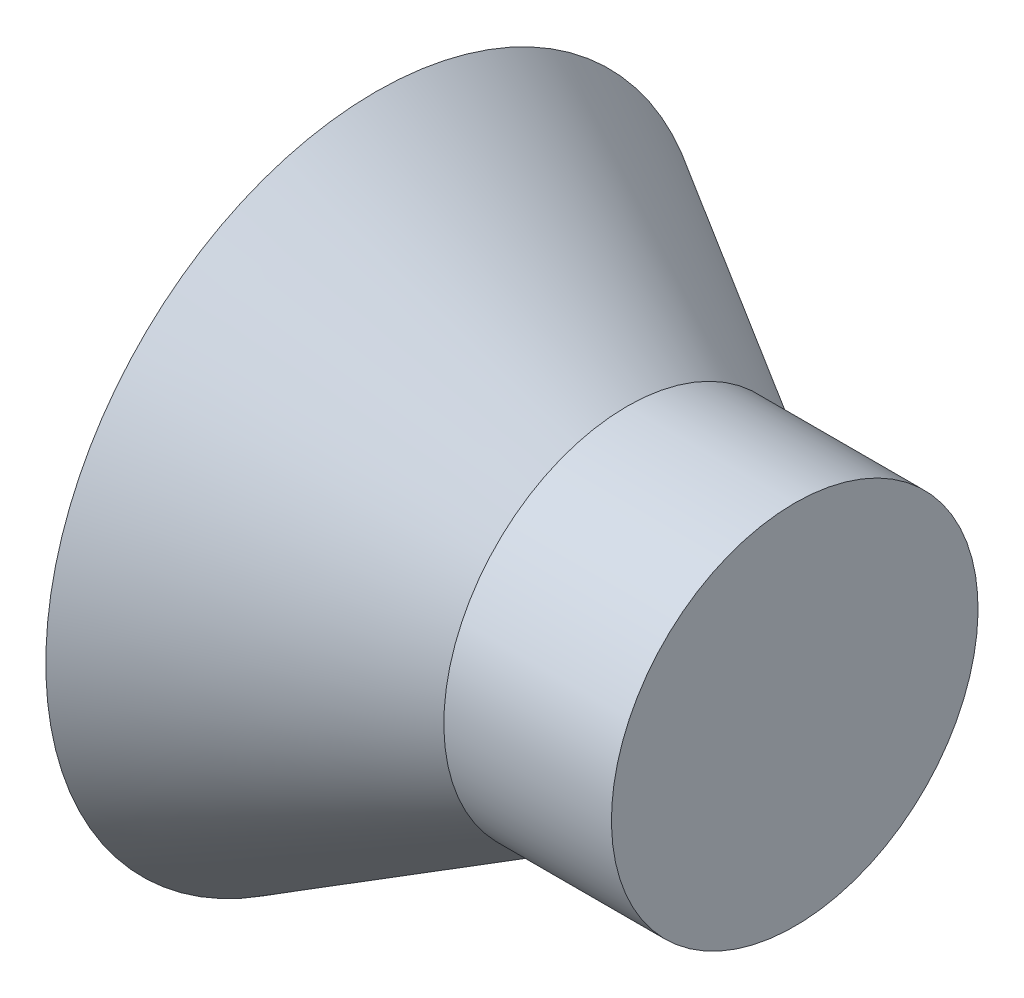
ISO-10303-21;
HEADER;
FILE_DESCRIPTION(('STEP AP214'),'2;1');
FILE_NAME('part.step','',(''),(''),'','','');
FILE_SCHEMA(('AUTOMOTIVE_DESIGN { 1 0 10303 214 1 1 1 1 }'));
ENDSEC;
DATA;
#1=APPLICATION_CONTEXT('core data for automotive mechanical design processes');
#2=APPLICATION_PROTOCOL_DEFINITION('international standard','automotive_design',2000,#1);
#3=PRODUCT_CONTEXT('',#1,'mechanical');
#4=PRODUCT('Part','Part','',(#3));
#5=PRODUCT_RELATED_PRODUCT_CATEGORY('part','',(#4));
#6=PRODUCT_DEFINITION_FORMATION('','',#4);
#7=PRODUCT_DEFINITION_CONTEXT('part definition',#1,'design');
#8=PRODUCT_DEFINITION('design','',#6,#7);
#9=PRODUCT_DEFINITION_SHAPE('','',#8);
#10=(LENGTH_UNIT() NAMED_UNIT(*) SI_UNIT(.MILLI.,.METRE.));
#11=(NAMED_UNIT(*) PLANE_ANGLE_UNIT() SI_UNIT($,.RADIAN.));
#12=(NAMED_UNIT(*) SI_UNIT($,.STERADIAN.) SOLID_ANGLE_UNIT());
#13=UNCERTAINTY_MEASURE_WITH_UNIT(LENGTH_MEASURE(1.E-05),#10,'distance_accuracy_value','');
#14=(GEOMETRIC_REPRESENTATION_CONTEXT(3) GLOBAL_UNCERTAINTY_ASSIGNED_CONTEXT((#13)) GLOBAL_UNIT_ASSIGNED_CONTEXT((#10,
#11,#12)) REPRESENTATION_CONTEXT('',''));
#15=CARTESIAN_POINT('',(0.,0.,0.));
#16=DIRECTION('',(0.,0.,1.));
#17=DIRECTION('',(1.,0.,0.));
#18=AXIS2_PLACEMENT_3D('',#15,#16,#17);
#19=CARTESIAN_POINT('',(0.,0.,0.));
#20=DIRECTION('',(-1.,0.,0.));
#21=DIRECTION('',(0.,-1.,0.));
#22=AXIS2_PLACEMENT_3D('',#19,#20,#21);
#23=PLANE('',#22);
#24=DIRECTION('',(0.,0.,1.));
#25=VECTOR('',#24,1.);
#26=CARTESIAN_POINT('',(0.,-2.,0.));
#27=LINE('',#26,#25);
#28=CARTESIAN_POINT('',(0.,-2.,-0.4));
#29=VERTEX_POINT('',#28);
#30=CARTESIAN_POINT('',(0.,-2.,0.4));
#31=VERTEX_POINT('',#30);
#32=EDGE_CURVE('E53',#29,#31,#27,.T.);
#33=ORIENTED_EDGE('',*,*,#32,.F.);
#34=DIRECTION('',(0.,1.,0.));
#35=VECTOR('',#34,1.);
#36=CARTESIAN_POINT('',(0.,0.,-0.4));
#37=LINE('',#36,#35);
#38=CARTESIAN_POINT('',(0.,-0.4,-0.4));
#39=VERTEX_POINT('',#38);
#40=EDGE_CURVE('E187',#29,#39,#37,.T.);
#41=ORIENTED_EDGE('',*,*,#40,.T.);
#42=DIRECTION('',(0.,0.,1.));
#43=VECTOR('',#42,1.);
#44=CARTESIAN_POINT('',(0.,-0.4,0.));
#45=LINE('',#44,#43);
#46=CARTESIAN_POINT('',(0.,-0.4,-2.));
#47=VERTEX_POINT('',#46);
#48=EDGE_CURVE('E185',#47,#39,#45,.T.);
#49=ORIENTED_EDGE('',*,*,#48,.F.);
#50=DIRECTION('',(0.,1.,0.));
#51=VECTOR('',#50,1.);
#52=CARTESIAN_POINT('',(0.,0.,-2.));
#53=LINE('',#52,#51);
#54=CARTESIAN_POINT('',(0.,0.4,-2.));
#55=VERTEX_POINT('',#54);
#56=EDGE_CURVE('E135',#47,#55,#53,.T.);
#57=ORIENTED_EDGE('',*,*,#56,.T.);
#58=DIRECTION('',(0.,0.,1.));
#59=VECTOR('',#58,1.);
#60=CARTESIAN_POINT('',(0.,0.4,0.));
#61=LINE('',#60,#59);
#62=CARTESIAN_POINT('',(0.,0.4,-0.4));
#63=VERTEX_POINT('',#62);
#64=EDGE_CURVE('E181',#55,#63,#61,.T.);
#65=ORIENTED_EDGE('',*,*,#64,.T.);
#66=DIRECTION('',(0.,1.,0.));
#67=VECTOR('',#66,1.);
#68=CARTESIAN_POINT('',(0.,0.,-0.4));
#69=LINE('',#68,#67);
#70=CARTESIAN_POINT('',(0.,2.,-0.4));
#71=VERTEX_POINT('',#70);
#72=EDGE_CURVE('E178',#63,#71,#69,.T.);
#73=ORIENTED_EDGE('',*,*,#72,.T.);
#74=DIRECTION('',(0.,0.,1.));
#75=VECTOR('',#74,1.);
#76=CARTESIAN_POINT('',(0.,2.,0.));
#77=LINE('',#76,#75);
#78=CARTESIAN_POINT('',(0.,2.,0.4));
#79=VERTEX_POINT('',#78);
#80=EDGE_CURVE('E175',#71,#79,#77,.T.);
#81=ORIENTED_EDGE('',*,*,#80,.T.);
#82=DIRECTION('',(0.,1.,0.));
#83=VECTOR('',#82,1.);
#84=CARTESIAN_POINT('',(0.,0.,0.4));
#85=LINE('',#84,#83);
#86=CARTESIAN_POINT('',(0.,0.4,0.4));
#87=VERTEX_POINT('',#86);
#88=EDGE_CURVE('E172',#87,#79,#85,.T.);
#89=ORIENTED_EDGE('',*,*,#88,.F.);
#90=DIRECTION('',(0.,0.,1.));
#91=VECTOR('',#90,1.);
#92=CARTESIAN_POINT('',(0.,0.4,0.));
#93=LINE('',#92,#91);
#94=CARTESIAN_POINT('',(0.,0.4,2.));
#95=VERTEX_POINT('',#94);
#96=EDGE_CURVE('E169',#87,#95,#93,.T.);
#97=ORIENTED_EDGE('',*,*,#96,.T.);
#98=DIRECTION('',(0.,1.,0.));
#99=VECTOR('',#98,1.);
#100=CARTESIAN_POINT('',(0.,0.,2.));
#101=LINE('',#100,#99);
#102=CARTESIAN_POINT('',(0.,-0.4,2.));
#103=VERTEX_POINT('',#102);
#104=EDGE_CURVE('E166',#103,#95,#101,.T.);
#105=ORIENTED_EDGE('',*,*,#104,.F.);
#106=DIRECTION('',(0.,0.,1.));
#107=VECTOR('',#106,1.);
#108=CARTESIAN_POINT('',(0.,-0.4,0.));
#109=LINE('',#108,#107);
#110=CARTESIAN_POINT('',(0.,-0.4,0.4));
#111=VERTEX_POINT('',#110);
#112=EDGE_CURVE('E163',#111,#103,#109,.T.);
#113=ORIENTED_EDGE('',*,*,#112,.F.);
#114=DIRECTION('',(0.,1.,0.));
#115=VECTOR('',#114,1.);
#116=CARTESIAN_POINT('',(0.,0.,0.4));
#117=LINE('',#116,#115);
#118=EDGE_CURVE('E160',#31,#111,#117,.T.);
#119=ORIENTED_EDGE('',*,*,#118,.F.);
#120=EDGE_LOOP('',(#33,#41,#49,#57,#65,#73,#81,#89,#97,#105,#113,#119));
#121=FACE_BOUND('',#120,.T.);
#122=CARTESIAN_POINT('',(0.,0.,0.));
#123=DIRECTION('',(1.,0.,0.));
#124=DIRECTION('',(0.,1.,0.));
#125=AXIS2_PLACEMENT_3D('',#122,#123,#124);
#126=CIRCLE('',#125,3.15);
#127=CARTESIAN_POINT('',(0.,3.15,0.));
#128=VERTEX_POINT('',#127);
#129=EDGE_CURVE('E11',#128,#128,#126,.T.);
#130=ORIENTED_EDGE('',*,*,#129,.F.);
#131=EDGE_LOOP('',(#130));
#132=FACE_BOUND('',#131,.T.);
#133=ADVANCED_FACE('F39',(#121,#132),#23,.T.);
#134=CARTESIAN_POINT('',(2.4,0.,0.));
#135=DIRECTION('',(-1.,0.,0.));
#136=DIRECTION('',(0.,-1.,0.));
#137=AXIS2_PLACEMENT_3D('',#134,#135,#136);
#138=CONICAL_SURFACE('',#137,1.75,0.52807444842636);
#139=ORIENTED_EDGE('',*,*,#129,.T.);
#140=EDGE_LOOP('',(#139));
#141=FACE_BOUND('',#140,.T.);
#142=CARTESIAN_POINT('',(2.4,0.,0.));
#143=DIRECTION('',(1.,0.,0.));
#144=DIRECTION('',(0.,1.,0.));
#145=AXIS2_PLACEMENT_3D('',#142,#143,#144);
#146=CIRCLE('',#145,1.75);
#147=CARTESIAN_POINT('',(2.4,1.75,0.));
#148=VERTEX_POINT('',#147);
#149=EDGE_CURVE('E46',#148,#148,#146,.T.);
#150=ORIENTED_EDGE('',*,*,#149,.F.);
#151=EDGE_LOOP('',(#150));
#152=FACE_BOUND('',#151,.T.);
#153=ADVANCED_FACE('F217',(#141,#152),#138,.T.);
#154=CARTESIAN_POINT('',(4.,0.,0.));
#155=DIRECTION('',(1.,0.,0.));
#156=DIRECTION('',(0.,1.,0.));
#157=AXIS2_PLACEMENT_3D('',#154,#155,#156);
#158=CYLINDRICAL_SURFACE('',#157,1.75);
#159=ORIENTED_EDGE('',*,*,#149,.T.);
#160=EDGE_LOOP('',(#159));
#161=FACE_BOUND('',#160,.T.);
#162=CARTESIAN_POINT('',(4.,0.,0.));
#163=DIRECTION('',(1.,0.,0.));
#164=DIRECTION('',(0.,1.,0.));
#165=AXIS2_PLACEMENT_3D('',#162,#163,#164);
#166=CIRCLE('',#165,1.75);
#167=CARTESIAN_POINT('',(4.,1.75,0.));
#168=VERTEX_POINT('',#167);
#169=EDGE_CURVE('E192',#168,#168,#166,.T.);
#170=ORIENTED_EDGE('',*,*,#169,.F.);
#171=EDGE_LOOP('',(#170));
#172=FACE_BOUND('',#171,.T.);
#173=ADVANCED_FACE('F214',(#161,#172),#158,.T.);
#174=CARTESIAN_POINT('',(4.,1.75,0.));
#175=DIRECTION('',(1.,0.,0.));
#176=DIRECTION('',(0.,1.,0.));
#177=AXIS2_PLACEMENT_3D('',#174,#175,#176);
#178=PLANE('',#177);
#179=ORIENTED_EDGE('',*,*,#169,.T.);
#180=EDGE_LOOP('',(#179));
#181=FACE_BOUND('',#180,.T.);
#182=ADVANCED_FACE('F224',(#181),#178,.T.);
#183=CARTESIAN_POINT('',(0.5,-2.,0.));
#184=DIRECTION('',(0.,-1.,0.));
#185=DIRECTION('',(1.,0.,0.));
#186=AXIS2_PLACEMENT_3D('',#183,#184,#185);
#187=PLANE('',#186);
#188=ORIENTED_EDGE('',*,*,#32,.T.);
#189=DIRECTION('',(-1.,0.,0.));
#190=VECTOR('',#189,1.);
#191=CARTESIAN_POINT('',(0.5,-2.,0.4));
#192=LINE('',#191,#190);
#193=CARTESIAN_POINT('',(0.5,-2.,0.4));
#194=VERTEX_POINT('',#193);
#195=EDGE_CURVE('E101',#194,#31,#192,.T.);
#196=ORIENTED_EDGE('',*,*,#195,.F.);
#197=DIRECTION('',(0.,0.,1.));
#198=VECTOR('',#197,1.);
#199=CARTESIAN_POINT('',(0.5,-2.,0.));
#200=LINE('',#199,#198);
#201=CARTESIAN_POINT('',(0.5,-2.,-0.4));
#202=VERTEX_POINT('',#201);
#203=EDGE_CURVE('E190',#202,#194,#200,.T.);
#204=ORIENTED_EDGE('',*,*,#203,.F.);
#205=DIRECTION('',(-1.,0.,0.));
#206=VECTOR('',#205,1.);
#207=CARTESIAN_POINT('',(0.5,-2.,-0.4));
#208=LINE('',#207,#206);
#209=EDGE_CURVE('E61',#202,#29,#208,.T.);
#210=ORIENTED_EDGE('',*,*,#209,.T.);
#211=EDGE_LOOP('',(#188,#196,#204,#210));
#212=FACE_BOUND('',#211,.T.);
#213=ADVANCED_FACE('F230',(#212),#187,.F.);
#214=CARTESIAN_POINT('',(0.5,0.,-0.4));
#215=DIRECTION('',(0.,0.,1.));
#216=DIRECTION('',(1.,0.,0.));
#217=AXIS2_PLACEMENT_3D('',#214,#215,#216);
#218=PLANE('',#217);
#219=ORIENTED_EDGE('',*,*,#40,.F.);
#220=ORIENTED_EDGE('',*,*,#209,.F.);
#221=DIRECTION('',(0.,1.,0.));
#222=VECTOR('',#221,1.);
#223=CARTESIAN_POINT('',(0.5,0.,-0.4));
#224=LINE('',#223,#222);
#225=CARTESIAN_POINT('',(0.5,-0.4,-0.4));
#226=VERTEX_POINT('',#225);
#227=EDGE_CURVE('E154',#202,#226,#224,.T.);
#228=ORIENTED_EDGE('',*,*,#227,.T.);
#229=DIRECTION('',(-1.,0.,0.));
#230=VECTOR('',#229,1.);
#231=CARTESIAN_POINT('',(0.5,-0.4,-0.4));
#232=LINE('',#231,#230);
#233=EDGE_CURVE('E140',#226,#39,#232,.T.);
#234=ORIENTED_EDGE('',*,*,#233,.T.);
#235=EDGE_LOOP('',(#219,#220,#228,#234));
#236=FACE_BOUND('',#235,.T.);
#237=ADVANCED_FACE('F234',(#236),#218,.T.);
#238=CARTESIAN_POINT('',(0.5,-0.4,0.));
#239=DIRECTION('',(0.,-1.,0.));
#240=DIRECTION('',(1.,0.,0.));
#241=AXIS2_PLACEMENT_3D('',#238,#239,#240);
#242=PLANE('',#241);
#243=ORIENTED_EDGE('',*,*,#48,.T.);
#244=ORIENTED_EDGE('',*,*,#233,.F.);
#245=DIRECTION('',(0.,0.,1.));
#246=VECTOR('',#245,1.);
#247=CARTESIAN_POINT('',(0.5,-0.4,0.));
#248=LINE('',#247,#246);
#249=CARTESIAN_POINT('',(0.5,-0.4,-2.));
#250=VERTEX_POINT('',#249);
#251=EDGE_CURVE('E148',#250,#226,#248,.T.);
#252=ORIENTED_EDGE('',*,*,#251,.F.);
#253=DIRECTION('',(-1.,0.,0.));
#254=VECTOR('',#253,1.);
#255=CARTESIAN_POINT('',(0.5,-0.4,-2.));
#256=LINE('',#255,#254);
#257=EDGE_CURVE('E129',#250,#47,#256,.T.);
#258=ORIENTED_EDGE('',*,*,#257,.T.);
#259=EDGE_LOOP('',(#243,#244,#252,#258));
#260=FACE_BOUND('',#259,.T.);
#261=ADVANCED_FACE('F153',(#260),#242,.F.);
#262=CARTESIAN_POINT('',(0.5,0.,-2.));
#263=DIRECTION('',(0.,0.,1.));
#264=DIRECTION('',(1.,0.,0.));
#265=AXIS2_PLACEMENT_3D('',#262,#263,#264);
#266=PLANE('',#265);
#267=ORIENTED_EDGE('',*,*,#56,.F.);
#268=ORIENTED_EDGE('',*,*,#257,.F.);
#269=DIRECTION('',(0.,1.,0.));
#270=VECTOR('',#269,1.);
#271=CARTESIAN_POINT('',(0.5,0.,-2.));
#272=LINE('',#271,#270);
#273=CARTESIAN_POINT('',(0.5,0.4,-2.));
#274=VERTEX_POINT('',#273);
#275=EDGE_CURVE('E132',#250,#274,#272,.T.);
#276=ORIENTED_EDGE('',*,*,#275,.T.);
#277=DIRECTION('',(-1.,0.,0.));
#278=VECTOR('',#277,1.);
#279=CARTESIAN_POINT('',(0.5,0.4,-2.));
#280=LINE('',#279,#278);
#281=EDGE_CURVE('E141',#274,#55,#280,.T.);
#282=ORIENTED_EDGE('',*,*,#281,.T.);
#283=EDGE_LOOP('',(#267,#268,#276,#282));
#284=FACE_BOUND('',#283,.T.);
#285=ADVANCED_FACE('F131',(#284),#266,.T.);
#286=CARTESIAN_POINT('',(0.5,0.4,0.));
#287=DIRECTION('',(0.,-1.,0.));
#288=DIRECTION('',(1.,0.,0.));
#289=AXIS2_PLACEMENT_3D('',#286,#287,#288);
#290=PLANE('',#289);
#291=ORIENTED_EDGE('',*,*,#64,.F.);
#292=ORIENTED_EDGE('',*,*,#281,.F.);
#293=DIRECTION('',(0.,0.,1.));
#294=VECTOR('',#293,1.);
#295=CARTESIAN_POINT('',(0.5,0.4,0.));
#296=LINE('',#295,#294);
#297=CARTESIAN_POINT('',(0.5,0.4,-0.4));
#298=VERTEX_POINT('',#297);
#299=EDGE_CURVE('E150',#274,#298,#296,.T.);
#300=ORIENTED_EDGE('',*,*,#299,.T.);
#301=DIRECTION('',(-1.,0.,0.));
#302=VECTOR('',#301,1.);
#303=CARTESIAN_POINT('',(0.5,0.4,-0.4));
#304=LINE('',#303,#302);
#305=EDGE_CURVE('E195',#298,#63,#304,.T.);
#306=ORIENTED_EDGE('',*,*,#305,.T.);
#307=EDGE_LOOP('',(#291,#292,#300,#306));
#308=FACE_BOUND('',#307,.T.);
#309=ADVANCED_FACE('F262',(#308),#290,.T.);
#310=CARTESIAN_POINT('',(0.5,0.,-0.4));
#311=DIRECTION('',(0.,0.,1.));
#312=DIRECTION('',(1.,0.,0.));
#313=AXIS2_PLACEMENT_3D('',#310,#311,#312);
#314=PLANE('',#313);
#315=ORIENTED_EDGE('',*,*,#72,.F.);
#316=ORIENTED_EDGE('',*,*,#305,.F.);
#317=DIRECTION('',(0.,1.,0.));
#318=VECTOR('',#317,1.);
#319=CARTESIAN_POINT('',(0.5,0.,-0.4));
#320=LINE('',#319,#318);
#321=CARTESIAN_POINT('',(0.5,2.,-0.4));
#322=VERTEX_POINT('',#321);
#323=EDGE_CURVE('E414',#298,#322,#320,.T.);
#324=ORIENTED_EDGE('',*,*,#323,.T.);
#325=DIRECTION('',(-1.,0.,0.));
#326=VECTOR('',#325,1.);
#327=CARTESIAN_POINT('',(0.5,2.,-0.4));
#328=LINE('',#327,#326);
#329=EDGE_CURVE('E197',#322,#71,#328,.T.);
#330=ORIENTED_EDGE('',*,*,#329,.T.);
#331=EDGE_LOOP('',(#315,#316,#324,#330));
#332=FACE_BOUND('',#331,.T.);
#333=ADVANCED_FACE('F258',(#332),#314,.T.);
#334=CARTESIAN_POINT('',(0.5,2.,0.));
#335=DIRECTION('',(0.,-1.,0.));
#336=DIRECTION('',(1.,0.,0.));
#337=AXIS2_PLACEMENT_3D('',#334,#335,#336);
#338=PLANE('',#337);
#339=ORIENTED_EDGE('',*,*,#80,.F.);
#340=ORIENTED_EDGE('',*,*,#329,.F.);
#341=DIRECTION('',(0.,0.,1.));
#342=VECTOR('',#341,1.);
#343=CARTESIAN_POINT('',(0.5,2.,0.));
#344=LINE('',#343,#342);
#345=CARTESIAN_POINT('',(0.5,2.,0.4));
#346=VERTEX_POINT('',#345);
#347=EDGE_CURVE('E412',#322,#346,#344,.T.);
#348=ORIENTED_EDGE('',*,*,#347,.T.);
#349=DIRECTION('',(-1.,0.,0.));
#350=VECTOR('',#349,1.);
#351=CARTESIAN_POINT('',(0.5,2.,0.4));
#352=LINE('',#351,#350);
#353=EDGE_CURVE('E199',#346,#79,#352,.T.);
#354=ORIENTED_EDGE('',*,*,#353,.T.);
#355=EDGE_LOOP('',(#339,#340,#348,#354));
#356=FACE_BOUND('',#355,.T.);
#357=ADVANCED_FACE('F254',(#356),#338,.T.);
#358=CARTESIAN_POINT('',(0.5,0.,0.4));
#359=DIRECTION('',(0.,0.,1.));
#360=DIRECTION('',(1.,0.,0.));
#361=AXIS2_PLACEMENT_3D('',#358,#359,#360);
#362=PLANE('',#361);
#363=ORIENTED_EDGE('',*,*,#88,.T.);
#364=ORIENTED_EDGE('',*,*,#353,.F.);
#365=DIRECTION('',(0.,1.,0.));
#366=VECTOR('',#365,1.);
#367=CARTESIAN_POINT('',(0.5,0.,0.4));
#368=LINE('',#367,#366);
#369=CARTESIAN_POINT('',(0.5,0.4,0.4));
#370=VERTEX_POINT('',#369);
#371=EDGE_CURVE('E409',#370,#346,#368,.T.);
#372=ORIENTED_EDGE('',*,*,#371,.F.);
#373=DIRECTION('',(-1.,0.,0.));
#374=VECTOR('',#373,1.);
#375=CARTESIAN_POINT('',(0.5,0.4,0.4));
#376=LINE('',#375,#374);
#377=EDGE_CURVE('E201',#370,#87,#376,.T.);
#378=ORIENTED_EDGE('',*,*,#377,.T.);
#379=EDGE_LOOP('',(#363,#364,#372,#378));
#380=FACE_BOUND('',#379,.T.);
#381=ADVANCED_FACE('F250',(#380),#362,.F.);
#382=CARTESIAN_POINT('',(0.5,0.4,0.));
#383=DIRECTION('',(0.,-1.,0.));
#384=DIRECTION('',(1.,0.,0.));
#385=AXIS2_PLACEMENT_3D('',#382,#383,#384);
#386=PLANE('',#385);
#387=ORIENTED_EDGE('',*,*,#96,.F.);
#388=ORIENTED_EDGE('',*,*,#377,.F.);
#389=DIRECTION('',(0.,0.,1.));
#390=VECTOR('',#389,1.);
#391=CARTESIAN_POINT('',(0.5,0.4,0.));
#392=LINE('',#391,#390);
#393=CARTESIAN_POINT('',(0.5,0.4,2.));
#394=VERTEX_POINT('',#393);
#395=EDGE_CURVE('E407',#370,#394,#392,.T.);
#396=ORIENTED_EDGE('',*,*,#395,.T.);
#397=DIRECTION('',(-1.,0.,0.));
#398=VECTOR('',#397,1.);
#399=CARTESIAN_POINT('',(0.5,0.4,2.));
#400=LINE('',#399,#398);
#401=EDGE_CURVE('E203',#394,#95,#400,.T.);
#402=ORIENTED_EDGE('',*,*,#401,.T.);
#403=EDGE_LOOP('',(#387,#388,#396,#402));
#404=FACE_BOUND('',#403,.T.);
#405=ADVANCED_FACE('F246',(#404),#386,.T.);
#406=CARTESIAN_POINT('',(0.5,0.,2.));
#407=DIRECTION('',(0.,0.,1.));
#408=DIRECTION('',(1.,0.,0.));
#409=AXIS2_PLACEMENT_3D('',#406,#407,#408);
#410=PLANE('',#409);
#411=ORIENTED_EDGE('',*,*,#104,.T.);
#412=ORIENTED_EDGE('',*,*,#401,.F.);
#413=DIRECTION('',(0.,1.,0.));
#414=VECTOR('',#413,1.);
#415=CARTESIAN_POINT('',(0.5,0.,2.));
#416=LINE('',#415,#414);
#417=CARTESIAN_POINT('',(0.5,-0.4,2.));
#418=VERTEX_POINT('',#417);
#419=EDGE_CURVE('E404',#418,#394,#416,.T.);
#420=ORIENTED_EDGE('',*,*,#419,.F.);
#421=DIRECTION('',(-1.,0.,0.));
#422=VECTOR('',#421,1.);
#423=CARTESIAN_POINT('',(0.5,-0.4,2.));
#424=LINE('',#423,#422);
#425=EDGE_CURVE('E205',#418,#103,#424,.T.);
#426=ORIENTED_EDGE('',*,*,#425,.T.);
#427=EDGE_LOOP('',(#411,#412,#420,#426));
#428=FACE_BOUND('',#427,.T.);
#429=ADVANCED_FACE('F242',(#428),#410,.F.);
#430=CARTESIAN_POINT('',(0.5,-0.4,0.));
#431=DIRECTION('',(0.,-1.,0.));
#432=DIRECTION('',(1.,0.,0.));
#433=AXIS2_PLACEMENT_3D('',#430,#431,#432);
#434=PLANE('',#433);
#435=ORIENTED_EDGE('',*,*,#112,.T.);
#436=ORIENTED_EDGE('',*,*,#425,.F.);
#437=DIRECTION('',(0.,0.,1.));
#438=VECTOR('',#437,1.);
#439=CARTESIAN_POINT('',(0.5,-0.4,0.));
#440=LINE('',#439,#438);
#441=CARTESIAN_POINT('',(0.5,-0.4,0.4));
#442=VERTEX_POINT('',#441);
#443=EDGE_CURVE('E399',#442,#418,#440,.T.);
#444=ORIENTED_EDGE('',*,*,#443,.F.);
#445=DIRECTION('',(-1.,0.,0.));
#446=VECTOR('',#445,1.);
#447=CARTESIAN_POINT('',(0.5,-0.4,0.4));
#448=LINE('',#447,#446);
#449=EDGE_CURVE('E207',#442,#111,#448,.T.);
#450=ORIENTED_EDGE('',*,*,#449,.T.);
#451=EDGE_LOOP('',(#435,#436,#444,#450));
#452=FACE_BOUND('',#451,.T.);
#453=ADVANCED_FACE('F238',(#452),#434,.F.);
#454=CARTESIAN_POINT('',(0.5,0.,0.4));
#455=DIRECTION('',(0.,0.,1.));
#456=DIRECTION('',(1.,0.,0.));
#457=AXIS2_PLACEMENT_3D('',#454,#455,#456);
#458=PLANE('',#457);
#459=ORIENTED_EDGE('',*,*,#118,.T.);
#460=ORIENTED_EDGE('',*,*,#449,.F.);
#461=DIRECTION('',(0.,1.,0.));
#462=VECTOR('',#461,1.);
#463=CARTESIAN_POINT('',(0.5,0.,0.4));
#464=LINE('',#463,#462);
#465=EDGE_CURVE('E397',#194,#442,#464,.T.);
#466=ORIENTED_EDGE('',*,*,#465,.F.);
#467=ORIENTED_EDGE('',*,*,#195,.T.);
#468=EDGE_LOOP('',(#459,#460,#466,#467));
#469=FACE_BOUND('',#468,.T.);
#470=ADVANCED_FACE('F235',(#469),#458,.F.);
#471=CARTESIAN_POINT('',(0.5,0.,0.));
#472=DIRECTION('',(-1.,0.,0.));
#473=DIRECTION('',(0.,-1.,0.));
#474=AXIS2_PLACEMENT_3D('',#471,#472,#473);
#475=PLANE('',#474);
#476=ORIENTED_EDGE('',*,*,#203,.T.);
#477=ORIENTED_EDGE('',*,*,#465,.T.);
#478=ORIENTED_EDGE('',*,*,#443,.T.);
#479=ORIENTED_EDGE('',*,*,#419,.T.);
#480=ORIENTED_EDGE('',*,*,#395,.F.);
#481=ORIENTED_EDGE('',*,*,#371,.T.);
#482=ORIENTED_EDGE('',*,*,#347,.F.);
#483=ORIENTED_EDGE('',*,*,#323,.F.);
#484=ORIENTED_EDGE('',*,*,#299,.F.);
#485=ORIENTED_EDGE('',*,*,#275,.F.);
#486=ORIENTED_EDGE('',*,*,#251,.T.);
#487=ORIENTED_EDGE('',*,*,#227,.F.);
#488=EDGE_LOOP('',(#476,#477,#478,#479,#480,#481,#482,#483,#484,#485,#486,#487));
#489=FACE_BOUND('',#488,.T.);
#490=ADVANCED_FACE('F147',(#489),#475,.T.);
#491=CLOSED_SHELL('',(#133,#153,#173,#182,#213,#237,#261,#285,#309,#333,#357,#381,#405,#429,
#453,#470,#490));
#492=MANIFOLD_SOLID_BREP('B2',#491);
#493=ADVANCED_BREP_SHAPE_REPRESENTATION('',(#18,#492),#14);
#494=SHAPE_DEFINITION_REPRESENTATION(#9,#493);
ENDSEC;
END-ISO-10303-21;
